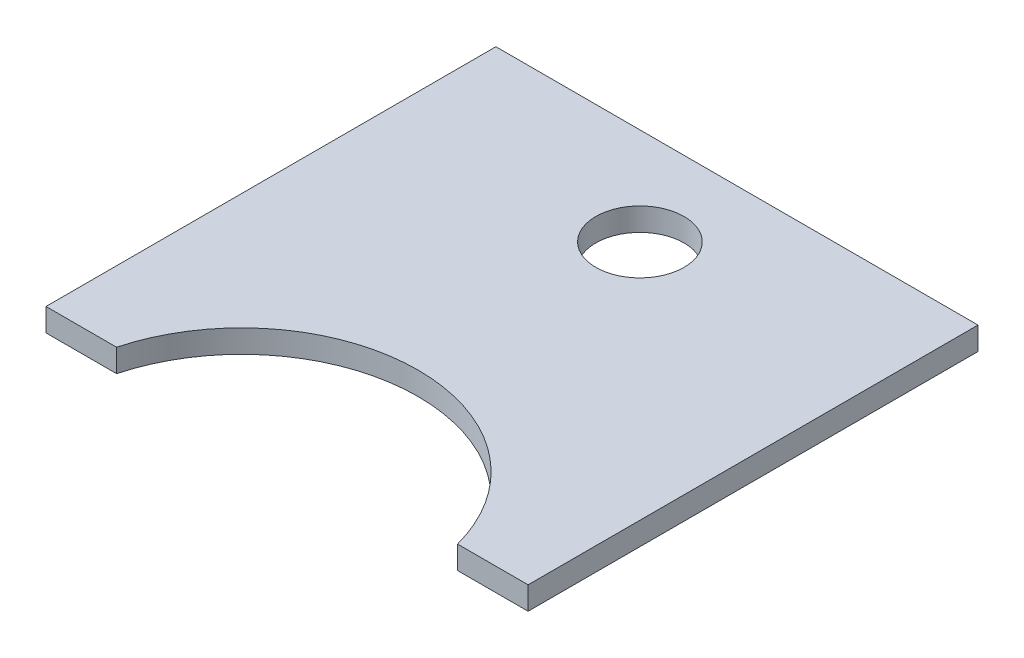
ISO-10303-21;
HEADER;
FILE_DESCRIPTION(('STEP AP214'),'2;1');
FILE_NAME('part.step','',(''),(''),'','','');
FILE_SCHEMA(('AUTOMOTIVE_DESIGN { 1 0 10303 214 1 1 1 1 }'));
ENDSEC;
DATA;
#1=APPLICATION_CONTEXT('core data for automotive mechanical design processes');
#2=APPLICATION_PROTOCOL_DEFINITION('international standard','automotive_design',2000,#1);
#3=PRODUCT_CONTEXT('',#1,'mechanical');
#4=PRODUCT('Part','Part','',(#3));
#5=PRODUCT_RELATED_PRODUCT_CATEGORY('part','',(#4));
#6=PRODUCT_DEFINITION_FORMATION('','',#4);
#7=PRODUCT_DEFINITION_CONTEXT('part definition',#1,'design');
#8=PRODUCT_DEFINITION('design','',#6,#7);
#9=PRODUCT_DEFINITION_SHAPE('','',#8);
#10=(LENGTH_UNIT() NAMED_UNIT(*) SI_UNIT(.MILLI.,.METRE.));
#11=(NAMED_UNIT(*) PLANE_ANGLE_UNIT() SI_UNIT($,.RADIAN.));
#12=(NAMED_UNIT(*) SI_UNIT($,.STERADIAN.) SOLID_ANGLE_UNIT());
#13=UNCERTAINTY_MEASURE_WITH_UNIT(LENGTH_MEASURE(1.E-05),#10,'distance_accuracy_value','');
#14=(GEOMETRIC_REPRESENTATION_CONTEXT(3) GLOBAL_UNCERTAINTY_ASSIGNED_CONTEXT((#13)) GLOBAL_UNIT_ASSIGNED_CONTEXT((#10,
#11,#12)) REPRESENTATION_CONTEXT('',''));
#15=CARTESIAN_POINT('',(0.,0.,0.));
#16=DIRECTION('',(0.,0.,1.));
#17=DIRECTION('',(1.,0.,0.));
#18=AXIS2_PLACEMENT_3D('',#15,#16,#17);
#19=CARTESIAN_POINT('',(0.,1.651,0.));
#20=DIRECTION('',(0.,-1.,0.));
#21=DIRECTION('',(0.,0.,-1.));
#22=AXIS2_PLACEMENT_3D('',#19,#20,#21);
#23=PLANE('',#22);
#24=DIRECTION('',(0.,0.,1.));
#25=VECTOR('',#24,1.);
#26=CARTESIAN_POINT('',(-17.3512853592609,1.651,-3.27193453962456));
#27=LINE('',#26,#25);
#28=CARTESIAN_POINT('',(-17.3512853592609,1.651,-35.6569345396246));
#29=VERTEX_POINT('',#28);
#30=CARTESIAN_POINT('',(-17.3512853592609,1.651,-3.27193453962456));
#31=VERTEX_POINT('',#30);
#32=EDGE_CURVE('E140',#29,#31,#27,.T.);
#33=ORIENTED_EDGE('',*,*,#32,.T.);
#34=DIRECTION('',(1.,0.,0.));
#35=VECTOR('',#34,1.);
#36=CARTESIAN_POINT('',(-17.3512853592609,1.651,-3.27193453962456));
#37=LINE('',#36,#35);
#38=CARTESIAN_POINT('',(-12.2712853592609,1.651,-3.27193453962456));
#39=VERTEX_POINT('',#38);
#40=EDGE_CURVE('E92',#31,#39,#37,.T.);
#41=ORIENTED_EDGE('',*,*,#40,.T.);
#42=CARTESIAN_POINT('',(0.,1.651,0.));
#43=DIRECTION('',(0.,-1.,0.));
#44=DIRECTION('',(0.,0.,-1.));
#45=AXIS2_PLACEMENT_3D('',#42,#43,#44);
#46=CIRCLE('',#45,12.7);
#47=CARTESIAN_POINT('',(12.2712853592609,1.651,-3.27193453962455));
#48=VERTEX_POINT('',#47);
#49=EDGE_CURVE('E107',#39,#48,#46,.T.);
#50=ORIENTED_EDGE('',*,*,#49,.T.);
#51=DIRECTION('',(1.,0.,0.));
#52=VECTOR('',#51,1.);
#53=CARTESIAN_POINT('',(17.3512853592609,1.651,-3.27193453962456));
#54=LINE('',#53,#52);
#55=CARTESIAN_POINT('',(17.3512853592609,1.651,-3.27193453962456));
#56=VERTEX_POINT('',#55);
#57=EDGE_CURVE('E105',#48,#56,#54,.T.);
#58=ORIENTED_EDGE('',*,*,#57,.T.);
#59=DIRECTION('',(0.,0.,-1.));
#60=VECTOR('',#59,1.);
#61=CARTESIAN_POINT('',(17.3512853592609,1.651,-35.6569345396246));
#62=LINE('',#61,#60);
#63=CARTESIAN_POINT('',(17.3512853592609,1.651,-35.6569345396246));
#64=VERTEX_POINT('',#63);
#65=EDGE_CURVE('E106',#56,#64,#62,.T.);
#66=ORIENTED_EDGE('',*,*,#65,.T.);
#67=DIRECTION('',(-1.,0.,0.));
#68=VECTOR('',#67,1.);
#69=CARTESIAN_POINT('',(-17.3512853592609,1.651,-35.6569345396246));
#70=LINE('',#69,#68);
#71=EDGE_CURVE('E59',#64,#29,#70,.T.);
#72=ORIENTED_EDGE('',*,*,#71,.T.);
#73=EDGE_LOOP('',(#33,#41,#50,#58,#66,#72));
#74=FACE_BOUND('',#73,.T.);
#75=CARTESIAN_POINT('',(0.,1.651,-28.6719345396246));
#76=DIRECTION('',(0.,1.,0.));
#77=DIRECTION('',(0.,0.,1.));
#78=AXIS2_PLACEMENT_3D('',#75,#76,#77);
#79=CIRCLE('',#78,3.175);
#80=CARTESIAN_POINT('',(0.,1.651,-31.8469345396246));
#81=VERTEX_POINT('',#80);
#82=EDGE_CURVE('E128',#81,#81,#79,.T.);
#83=ORIENTED_EDGE('',*,*,#82,.F.);
#84=EDGE_LOOP('',(#83));
#85=FACE_BOUND('',#84,.T.);
#86=ADVANCED_FACE('F41',(#74,#85),#23,.F.);
#87=CARTESIAN_POINT('',(0.,0.,0.));
#88=DIRECTION('',(0.,-1.,0.));
#89=DIRECTION('',(0.,0.,-1.));
#90=AXIS2_PLACEMENT_3D('',#87,#88,#89);
#91=PLANE('',#90);
#92=DIRECTION('',(0.,0.,1.));
#93=VECTOR('',#92,1.);
#94=CARTESIAN_POINT('',(-17.3512853592609,0.,-3.27193453962456));
#95=LINE('',#94,#93);
#96=CARTESIAN_POINT('',(-17.3512853592609,0.,-35.6569345396246));
#97=VERTEX_POINT('',#96);
#98=CARTESIAN_POINT('',(-17.3512853592609,0.,-3.27193453962456));
#99=VERTEX_POINT('',#98);
#100=EDGE_CURVE('E127',#97,#99,#95,.T.);
#101=ORIENTED_EDGE('',*,*,#100,.F.);
#102=DIRECTION('',(-1.,0.,0.));
#103=VECTOR('',#102,1.);
#104=CARTESIAN_POINT('',(-17.3512853592609,0.,-35.6569345396246));
#105=LINE('',#104,#103);
#106=CARTESIAN_POINT('',(17.3512853592609,0.,-35.6569345396246));
#107=VERTEX_POINT('',#106);
#108=EDGE_CURVE('E87',#107,#97,#105,.T.);
#109=ORIENTED_EDGE('',*,*,#108,.F.);
#110=DIRECTION('',(0.,0.,-1.));
#111=VECTOR('',#110,1.);
#112=CARTESIAN_POINT('',(17.3512853592609,0.,-35.6569345396246));
#113=LINE('',#112,#111);
#114=CARTESIAN_POINT('',(17.3512853592609,0.,-3.27193453962456));
#115=VERTEX_POINT('',#114);
#116=EDGE_CURVE('E82',#115,#107,#113,.T.);
#117=ORIENTED_EDGE('',*,*,#116,.F.);
#118=DIRECTION('',(1.,0.,0.));
#119=VECTOR('',#118,1.);
#120=CARTESIAN_POINT('',(17.3512853592609,0.,-3.27193453962456));
#121=LINE('',#120,#119);
#122=CARTESIAN_POINT('',(12.2712853592609,0.,-3.27193453962455));
#123=VERTEX_POINT('',#122);
#124=EDGE_CURVE('E118',#123,#115,#121,.T.);
#125=ORIENTED_EDGE('',*,*,#124,.F.);
#126=CARTESIAN_POINT('',(0.,0.,0.));
#127=DIRECTION('',(0.,-1.,0.));
#128=DIRECTION('',(0.,0.,-1.));
#129=AXIS2_PLACEMENT_3D('',#126,#127,#128);
#130=CIRCLE('',#129,12.7);
#131=CARTESIAN_POINT('',(-12.2712853592609,0.,-3.27193453962456));
#132=VERTEX_POINT('',#131);
#133=EDGE_CURVE('E135',#132,#123,#130,.T.);
#134=ORIENTED_EDGE('',*,*,#133,.F.);
#135=DIRECTION('',(1.,0.,0.));
#136=VECTOR('',#135,1.);
#137=CARTESIAN_POINT('',(-17.3512853592609,0.,-3.27193453962456));
#138=LINE('',#137,#136);
#139=EDGE_CURVE('E129',#99,#132,#138,.T.);
#140=ORIENTED_EDGE('',*,*,#139,.F.);
#141=EDGE_LOOP('',(#101,#109,#117,#125,#134,#140));
#142=FACE_BOUND('',#141,.T.);
#143=CARTESIAN_POINT('',(0.,0.,-28.6719345396246));
#144=DIRECTION('',(0.,1.,0.));
#145=DIRECTION('',(0.,0.,1.));
#146=AXIS2_PLACEMENT_3D('',#143,#144,#145);
#147=CIRCLE('',#146,3.175);
#148=CARTESIAN_POINT('',(0.,0.,-31.8469345396246));
#149=VERTEX_POINT('',#148);
#150=EDGE_CURVE('E227',#149,#149,#147,.T.);
#151=ORIENTED_EDGE('',*,*,#150,.T.);
#152=EDGE_LOOP('',(#151));
#153=FACE_BOUND('',#152,.T.);
#154=ADVANCED_FACE('F148',(#142,#153),#91,.T.);
#155=CARTESIAN_POINT('',(-17.3512853592609,1.651,-3.27193453962456));
#156=DIRECTION('',(1.,0.,0.));
#157=DIRECTION('',(0.,0.,-1.));
#158=AXIS2_PLACEMENT_3D('',#155,#156,#157);
#159=PLANE('',#158);
#160=ORIENTED_EDGE('',*,*,#100,.T.);
#161=DIRECTION('',(0.,-1.,0.));
#162=VECTOR('',#161,1.);
#163=CARTESIAN_POINT('',(-17.3512853592609,1.651,-3.27193453962456));
#164=LINE('',#163,#162);
#165=EDGE_CURVE('E11',#31,#99,#164,.T.);
#166=ORIENTED_EDGE('',*,*,#165,.F.);
#167=ORIENTED_EDGE('',*,*,#32,.F.);
#168=DIRECTION('',(0.,-1.,0.));
#169=VECTOR('',#168,1.);
#170=CARTESIAN_POINT('',(-17.3512853592609,1.651,-35.6569345396246));
#171=LINE('',#170,#169);
#172=EDGE_CURVE('E124',#29,#97,#171,.T.);
#173=ORIENTED_EDGE('',*,*,#172,.T.);
#174=EDGE_LOOP('',(#160,#166,#167,#173));
#175=FACE_BOUND('',#174,.T.);
#176=ADVANCED_FACE('F43',(#175),#159,.F.);
#177=CARTESIAN_POINT('',(-17.3512853592609,1.651,-3.27193453962456));
#178=DIRECTION('',(0.,0.,-1.));
#179=DIRECTION('',(-1.,0.,0.));
#180=AXIS2_PLACEMENT_3D('',#177,#178,#179);
#181=PLANE('',#180);
#182=ORIENTED_EDGE('',*,*,#139,.T.);
#183=DIRECTION('',(0.,-1.,0.));
#184=VECTOR('',#183,1.);
#185=CARTESIAN_POINT('',(-12.2712853592609,1.651,-3.27193453962456));
#186=LINE('',#185,#184);
#187=EDGE_CURVE('E49',#39,#132,#186,.T.);
#188=ORIENTED_EDGE('',*,*,#187,.F.);
#189=ORIENTED_EDGE('',*,*,#40,.F.);
#190=ORIENTED_EDGE('',*,*,#165,.T.);
#191=EDGE_LOOP('',(#182,#188,#189,#190));
#192=FACE_BOUND('',#191,.T.);
#193=ADVANCED_FACE('F173',(#192),#181,.F.);
#194=CARTESIAN_POINT('',(0.,1.651,0.));
#195=DIRECTION('',(0.,-1.,0.));
#196=DIRECTION('',(0.,0.,-1.));
#197=AXIS2_PLACEMENT_3D('',#194,#195,#196);
#198=CYLINDRICAL_SURFACE('',#197,12.7);
#199=ORIENTED_EDGE('',*,*,#133,.T.);
#200=DIRECTION('',(0.,-1.,0.));
#201=VECTOR('',#200,1.);
#202=CARTESIAN_POINT('',(12.2712853592609,1.651,-3.27193453962455));
#203=LINE('',#202,#201);
#204=EDGE_CURVE('E120',#48,#123,#203,.T.);
#205=ORIENTED_EDGE('',*,*,#204,.F.);
#206=ORIENTED_EDGE('',*,*,#49,.F.);
#207=ORIENTED_EDGE('',*,*,#187,.T.);
#208=EDGE_LOOP('',(#199,#205,#206,#207));
#209=FACE_BOUND('',#208,.T.);
#210=ADVANCED_FACE('F141',(#209),#198,.F.);
#211=CARTESIAN_POINT('',(17.3512853592609,1.651,-3.27193453962456));
#212=DIRECTION('',(0.,0.,-1.));
#213=DIRECTION('',(-1.,0.,0.));
#214=AXIS2_PLACEMENT_3D('',#211,#212,#213);
#215=PLANE('',#214);
#216=ORIENTED_EDGE('',*,*,#124,.T.);
#217=DIRECTION('',(0.,-1.,0.));
#218=VECTOR('',#217,1.);
#219=CARTESIAN_POINT('',(17.3512853592609,1.651,-3.27193453962456));
#220=LINE('',#219,#218);
#221=EDGE_CURVE('E114',#56,#115,#220,.T.);
#222=ORIENTED_EDGE('',*,*,#221,.F.);
#223=ORIENTED_EDGE('',*,*,#57,.F.);
#224=ORIENTED_EDGE('',*,*,#204,.T.);
#225=EDGE_LOOP('',(#216,#222,#223,#224));
#226=FACE_BOUND('',#225,.T.);
#227=ADVANCED_FACE('F111',(#226),#215,.F.);
#228=CARTESIAN_POINT('',(17.3512853592609,1.651,-35.6569345396246));
#229=DIRECTION('',(-1.,0.,0.));
#230=DIRECTION('',(0.,0.,1.));
#231=AXIS2_PLACEMENT_3D('',#228,#229,#230);
#232=PLANE('',#231);
#233=ORIENTED_EDGE('',*,*,#116,.T.);
#234=DIRECTION('',(0.,-1.,0.));
#235=VECTOR('',#234,1.);
#236=CARTESIAN_POINT('',(17.3512853592609,1.651,-35.6569345396246));
#237=LINE('',#236,#235);
#238=EDGE_CURVE('E116',#64,#107,#237,.T.);
#239=ORIENTED_EDGE('',*,*,#238,.F.);
#240=ORIENTED_EDGE('',*,*,#65,.F.);
#241=ORIENTED_EDGE('',*,*,#221,.T.);
#242=EDGE_LOOP('',(#233,#239,#240,#241));
#243=FACE_BOUND('',#242,.T.);
#244=ADVANCED_FACE('F117',(#243),#232,.F.);
#245=CARTESIAN_POINT('',(-17.3512853592609,1.651,-35.6569345396246));
#246=DIRECTION('',(0.,0.,1.));
#247=DIRECTION('',(1.,0.,0.));
#248=AXIS2_PLACEMENT_3D('',#245,#246,#247);
#249=PLANE('',#248);
#250=ORIENTED_EDGE('',*,*,#108,.T.);
#251=ORIENTED_EDGE('',*,*,#172,.F.);
#252=ORIENTED_EDGE('',*,*,#71,.F.);
#253=ORIENTED_EDGE('',*,*,#238,.T.);
#254=EDGE_LOOP('',(#250,#251,#252,#253));
#255=FACE_BOUND('',#254,.T.);
#256=ADVANCED_FACE('F151',(#255),#249,.F.);
#257=CARTESIAN_POINT('',(0.,1.651,-28.6719345396246));
#258=DIRECTION('',(0.,-1.,0.));
#259=DIRECTION('',(0.,0.,-1.));
#260=AXIS2_PLACEMENT_3D('',#257,#258,#259);
#261=CYLINDRICAL_SURFACE('',#260,3.175);
#262=CARTESIAN_POINT('',(0.,1.651,-31.8469345396246));
#263=CARTESIAN_POINT('',(0.,1.63380208333333,-31.8469345396246));
#264=CARTESIAN_POINT('',(0.,1.61660416666667,-31.8469345396246));
#265=CARTESIAN_POINT('',(0.,1.58220833333333,-31.8469345396246));
#266=CARTESIAN_POINT('',(0.,1.56501041666667,-31.8469345396246));
#267=CARTESIAN_POINT('',(0.,1.53061458333333,-31.8469345396246));
#268=CARTESIAN_POINT('',(0.,1.51341666666667,-31.8469345396246));
#269=CARTESIAN_POINT('',(0.,1.47902083333333,-31.8469345396246));
#270=CARTESIAN_POINT('',(0.,1.46182291666667,-31.8469345396246));
#271=CARTESIAN_POINT('',(0.,1.42742708333333,-31.8469345396246));
#272=CARTESIAN_POINT('',(0.,1.41022916666667,-31.8469345396246));
#273=CARTESIAN_POINT('',(0.,1.37583333333333,-31.8469345396246));
#274=CARTESIAN_POINT('',(0.,1.35863541666667,-31.8469345396246));
#275=CARTESIAN_POINT('',(0.,1.32423958333333,-31.8469345396246));
#276=CARTESIAN_POINT('',(0.,1.30704166666667,-31.8469345396246));
#277=CARTESIAN_POINT('',(0.,1.27264583333333,-31.8469345396246));
#278=CARTESIAN_POINT('',(0.,1.25544791666667,-31.8469345396246));
#279=CARTESIAN_POINT('',(0.,1.22105208333333,-31.8469345396246));
#280=CARTESIAN_POINT('',(0.,1.20385416666667,-31.8469345396246));
#281=CARTESIAN_POINT('',(0.,1.16945833333333,-31.8469345396246));
#282=CARTESIAN_POINT('',(0.,1.15226041666667,-31.8469345396246));
#283=CARTESIAN_POINT('',(0.,1.11786458333333,-31.8469345396246));
#284=CARTESIAN_POINT('',(0.,1.10066666666667,-31.8469345396246));
#285=CARTESIAN_POINT('',(0.,1.06627083333333,-31.8469345396246));
#286=CARTESIAN_POINT('',(0.,1.04907291666667,-31.8469345396246));
#287=CARTESIAN_POINT('',(0.,1.01467708333333,-31.8469345396246));
#288=CARTESIAN_POINT('',(0.,0.997479166666666,-31.8469345396246));
#289=CARTESIAN_POINT('',(0.,0.963083333333333,-31.8469345396246));
#290=CARTESIAN_POINT('',(0.,0.945885416666667,-31.8469345396246));
#291=CARTESIAN_POINT('',(0.,0.911489583333333,-31.8469345396246));
#292=CARTESIAN_POINT('',(0.,0.894291666666667,-31.8469345396246));
#293=CARTESIAN_POINT('',(0.,0.859895833333333,-31.8469345396246));
#294=CARTESIAN_POINT('',(0.,0.842697916666667,-31.8469345396246));
#295=CARTESIAN_POINT('',(0.,0.808302083333333,-31.8469345396246));
#296=CARTESIAN_POINT('',(0.,0.791104166666667,-31.8469345396246));
#297=CARTESIAN_POINT('',(0.,0.756708333333333,-31.8469345396246));
#298=CARTESIAN_POINT('',(0.,0.739510416666667,-31.8469345396246));
#299=CARTESIAN_POINT('',(0.,0.705114583333333,-31.8469345396246));
#300=CARTESIAN_POINT('',(0.,0.687916666666667,-31.8469345396246));
#301=CARTESIAN_POINT('',(0.,0.653520833333333,-31.8469345396246));
#302=CARTESIAN_POINT('',(0.,0.636322916666667,-31.8469345396246));
#303=CARTESIAN_POINT('',(0.,0.601927083333333,-31.8469345396246));
#304=CARTESIAN_POINT('',(0.,0.584729166666667,-31.8469345396246));
#305=CARTESIAN_POINT('',(0.,0.550333333333333,-31.8469345396246));
#306=CARTESIAN_POINT('',(0.,0.533135416666667,-31.8469345396246));
#307=CARTESIAN_POINT('',(0.,0.498739583333333,-31.8469345396246));
#308=CARTESIAN_POINT('',(0.,0.481541666666667,-31.8469345396246));
#309=CARTESIAN_POINT('',(0.,0.447145833333333,-31.8469345396246));
#310=CARTESIAN_POINT('',(0.,0.429947916666667,-31.8469345396246));
#311=CARTESIAN_POINT('',(0.,0.395552083333333,-31.8469345396246));
#312=CARTESIAN_POINT('',(0.,0.378354166666667,-31.8469345396246));
#313=CARTESIAN_POINT('',(0.,0.343958333333333,-31.8469345396246));
#314=CARTESIAN_POINT('',(0.,0.326760416666667,-31.8469345396246));
#315=CARTESIAN_POINT('',(0.,0.292364583333333,-31.8469345396246));
#316=CARTESIAN_POINT('',(0.,0.275166666666667,-31.8469345396246));
#317=CARTESIAN_POINT('',(0.,0.240770833333333,-31.8469345396246));
#318=CARTESIAN_POINT('',(0.,0.223572916666667,-31.8469345396246));
#319=CARTESIAN_POINT('',(0.,0.189177083333333,-31.8469345396246));
#320=CARTESIAN_POINT('',(0.,0.171979166666667,-31.8469345396246));
#321=CARTESIAN_POINT('',(0.,0.137583333333333,-31.8469345396246));
#322=CARTESIAN_POINT('',(0.,0.120385416666667,-31.8469345396246));
#323=CARTESIAN_POINT('',(0.,0.0859895833333333,-31.8469345396246));
#324=CARTESIAN_POINT('',(0.,0.0687916666666667,-31.8469345396246));
#325=CARTESIAN_POINT('',(0.,0.0343958333333333,-31.8469345396246));
#326=CARTESIAN_POINT('',(0.,0.0171979166666666,-31.8469345396246));
#327=CARTESIAN_POINT('',(0.,0.,-31.8469345396246));
#328=B_SPLINE_CURVE_WITH_KNOTS('',3,(#262,#263,#264,#265,#266,#267,#268,#269,#270,#271,#272,
#273,#274,#275,#276,#277,#278,#279,#280,#281,#282,#283,#284,#285,#286,#287,#288,#289,#290,#291,
#292,#293,#294,#295,#296,#297,#298,#299,#300,#301,#302,#303,#304,#305,#306,#307,#308,#309,#310,
#311,#312,#313,#314,#315,#316,#317,#318,#319,#320,#321,#322,#323,#324,#325,#326,#327),
.UNSPECIFIED.,.F.,.F.,(4,2,2,2,2,2,2,2,2,2,2,2,2,2,2,2,2,2,2,2,2,2,2,2,2,2,2,2,2,2,2,2,4),(0.,
0.05159375,0.1031875,0.15478125,0.206375,0.25796875,0.3095625,0.36115625,0.41275,0.46434375,
0.5159375,0.56753125,0.619125,0.67071875,0.7223125,0.77390625,0.8255,0.87709375,0.9286875,
0.98028125,1.031875,1.08346875,1.1350625,1.18665625,1.23825,1.28984375,1.3414375,1.39303125,
1.444625,1.49621875,1.5478125,1.59940625,1.651),.UNSPECIFIED.);
#329=EDGE_CURVE('BSEAM153',#81,#149,#328,.T.);
#330=ORIENTED_EDGE('',*,*,#82,.T.);
#331=ORIENTED_EDGE('',*,*,#150,.F.);
#332=ORIENTED_EDGE('',*,*,#329,.T.);
#333=ORIENTED_EDGE('',*,*,#329,.F.);
#334=EDGE_LOOP('',(#330,#332,#331,#333));
#335=FACE_BOUND('',#334,.T.);
#336=ADVANCED_FACE('F153',(#335),#261,.F.);
#337=CLOSED_SHELL('',(#86,#154,#176,#193,#210,#227,#244,#256,#336));
#338=MANIFOLD_SOLID_BREP('B2',#337);
#339=ADVANCED_BREP_SHAPE_REPRESENTATION('',(#18,#338),#14);
#340=SHAPE_DEFINITION_REPRESENTATION(#9,#339);
ENDSEC;
END-ISO-10303-21;
